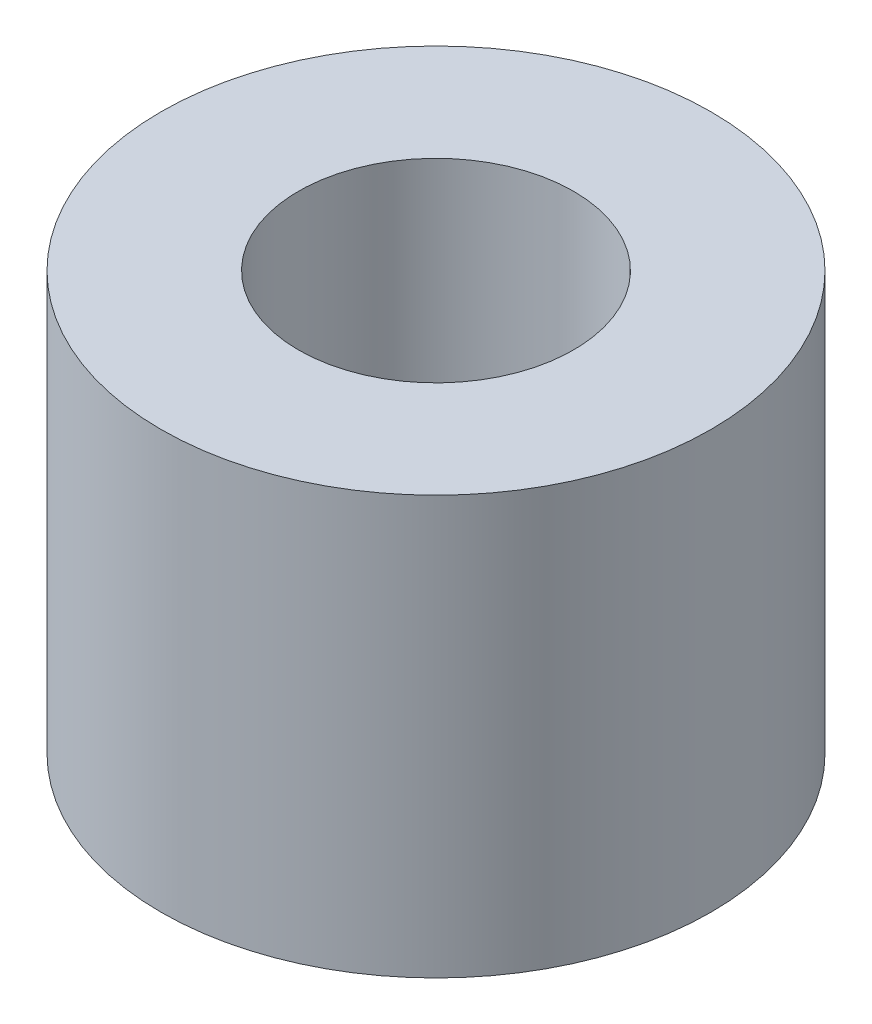
ISO-10303-21;
HEADER;
FILE_DESCRIPTION(('STEP AP214'),'2;1');
FILE_NAME('part.step','',(''),(''),'','','');
FILE_SCHEMA(('AUTOMOTIVE_DESIGN { 1 0 10303 214 1 1 1 1 }'));
ENDSEC;
DATA;
#1=APPLICATION_CONTEXT('core data for automotive mechanical design processes');
#2=APPLICATION_PROTOCOL_DEFINITION('international standard','automotive_design',2000,#1);
#3=PRODUCT_CONTEXT('',#1,'mechanical');
#4=PRODUCT('Part','Part','',(#3));
#5=PRODUCT_RELATED_PRODUCT_CATEGORY('part','',(#4));
#6=PRODUCT_DEFINITION_FORMATION('','',#4);
#7=PRODUCT_DEFINITION_CONTEXT('part definition',#1,'design');
#8=PRODUCT_DEFINITION('design','',#6,#7);
#9=PRODUCT_DEFINITION_SHAPE('','',#8);
#10=(LENGTH_UNIT() NAMED_UNIT(*) SI_UNIT(.MILLI.,.METRE.));
#11=(NAMED_UNIT(*) PLANE_ANGLE_UNIT() SI_UNIT($,.RADIAN.));
#12=(NAMED_UNIT(*) SI_UNIT($,.STERADIAN.) SOLID_ANGLE_UNIT());
#13=UNCERTAINTY_MEASURE_WITH_UNIT(LENGTH_MEASURE(1.E-05),#10,'distance_accuracy_value','');
#14=(GEOMETRIC_REPRESENTATION_CONTEXT(3) GLOBAL_UNCERTAINTY_ASSIGNED_CONTEXT((#13)) GLOBAL_UNIT_ASSIGNED_CONTEXT((#10,
#11,#12)) REPRESENTATION_CONTEXT('',''));
#15=CARTESIAN_POINT('',(0.,0.,0.));
#16=DIRECTION('',(0.,0.,1.));
#17=DIRECTION('',(1.,0.,0.));
#18=AXIS2_PLACEMENT_3D('',#15,#16,#17);
#19=CARTESIAN_POINT('',(0.,9.652,0.));
#20=DIRECTION('',(0.,1.,0.));
#21=DIRECTION('',(0.,0.,1.));
#22=AXIS2_PLACEMENT_3D('',#19,#20,#21);
#23=PLANE('',#22);
#24=CARTESIAN_POINT('',(0.,9.652,0.));
#25=DIRECTION('',(0.,1.,0.));
#26=DIRECTION('',(0.,0.,1.));
#27=AXIS2_PLACEMENT_3D('',#24,#25,#26);
#28=CIRCLE('',#27,6.35);
#29=CARTESIAN_POINT('',(0.,9.652,6.35));
#30=VERTEX_POINT('',#29);
#31=EDGE_CURVE('E10',#30,#30,#28,.T.);
#32=ORIENTED_EDGE('',*,*,#31,.T.);
#33=EDGE_LOOP('',(#32));
#34=FACE_BOUND('',#33,.T.);
#35=CARTESIAN_POINT('',(0.,9.652,0.));
#36=DIRECTION('',(0.,1.,0.));
#37=DIRECTION('',(0.,0.,1.));
#38=AXIS2_PLACEMENT_3D('',#35,#36,#37);
#39=CIRCLE('',#38,3.175);
#40=CARTESIAN_POINT('',(0.,9.652,3.175));
#41=VERTEX_POINT('',#40);
#42=EDGE_CURVE('E54',#41,#41,#39,.T.);
#43=ORIENTED_EDGE('',*,*,#42,.F.);
#44=EDGE_LOOP('',(#43));
#45=FACE_BOUND('',#44,.T.);
#46=ADVANCED_FACE('F43',(#34,#45),#23,.T.);
#47=CARTESIAN_POINT('',(0.,0.,0.));
#48=DIRECTION('',(0.,1.,0.));
#49=DIRECTION('',(0.,0.,1.));
#50=AXIS2_PLACEMENT_3D('',#47,#48,#49);
#51=PLANE('',#50);
#52=CARTESIAN_POINT('',(0.,0.,0.));
#53=DIRECTION('',(0.,1.,0.));
#54=DIRECTION('',(0.,0.,1.));
#55=AXIS2_PLACEMENT_3D('',#52,#53,#54);
#56=CIRCLE('',#55,6.35);
#57=CARTESIAN_POINT('',(0.,0.,6.35));
#58=VERTEX_POINT('',#57);
#59=EDGE_CURVE('E47',#58,#58,#56,.T.);
#60=ORIENTED_EDGE('',*,*,#59,.F.);
#61=EDGE_LOOP('',(#60));
#62=FACE_BOUND('',#61,.T.);
#63=CARTESIAN_POINT('',(0.,0.,0.));
#64=DIRECTION('',(0.,1.,0.));
#65=DIRECTION('',(0.,0.,1.));
#66=AXIS2_PLACEMENT_3D('',#63,#64,#65);
#67=CIRCLE('',#66,3.175);
#68=CARTESIAN_POINT('',(0.,0.,3.175));
#69=VERTEX_POINT('',#68);
#70=EDGE_CURVE('E56',#69,#69,#67,.T.);
#71=ORIENTED_EDGE('',*,*,#70,.T.);
#72=EDGE_LOOP('',(#71));
#73=FACE_BOUND('',#72,.T.);
#74=ADVANCED_FACE('F66',(#62,#73),#51,.F.);
#75=CARTESIAN_POINT('',(0.,9.652,0.));
#76=DIRECTION('',(0.,-1.,0.));
#77=DIRECTION('',(0.,0.,-1.));
#78=AXIS2_PLACEMENT_3D('',#75,#76,#77);
#79=CYLINDRICAL_SURFACE('',#78,6.35);
#80=ORIENTED_EDGE('',*,*,#31,.F.);
#81=EDGE_LOOP('',(#80));
#82=FACE_BOUND('',#81,.T.);
#83=ORIENTED_EDGE('',*,*,#59,.T.);
#84=EDGE_LOOP('',(#83));
#85=FACE_BOUND('',#84,.T.);
#86=ADVANCED_FACE('F45',(#82,#85),#79,.T.);
#87=CARTESIAN_POINT('',(0.,9.652,0.));
#88=DIRECTION('',(0.,-1.,0.));
#89=DIRECTION('',(0.,0.,-1.));
#90=AXIS2_PLACEMENT_3D('',#87,#88,#89);
#91=CYLINDRICAL_SURFACE('',#90,3.175);
#92=ORIENTED_EDGE('',*,*,#42,.T.);
#93=EDGE_LOOP('',(#92));
#94=FACE_BOUND('',#93,.T.);
#95=ORIENTED_EDGE('',*,*,#70,.F.);
#96=EDGE_LOOP('',(#95));
#97=FACE_BOUND('',#96,.T.);
#98=ADVANCED_FACE('F62',(#94,#97),#91,.F.);
#99=CLOSED_SHELL('',(#46,#74,#86,#98));
#100=MANIFOLD_SOLID_BREP('B2',#99);
#101=ADVANCED_BREP_SHAPE_REPRESENTATION('',(#18,#100),#14);
#102=SHAPE_DEFINITION_REPRESENTATION(#9,#101);
ENDSEC;
END-ISO-10303-21;
